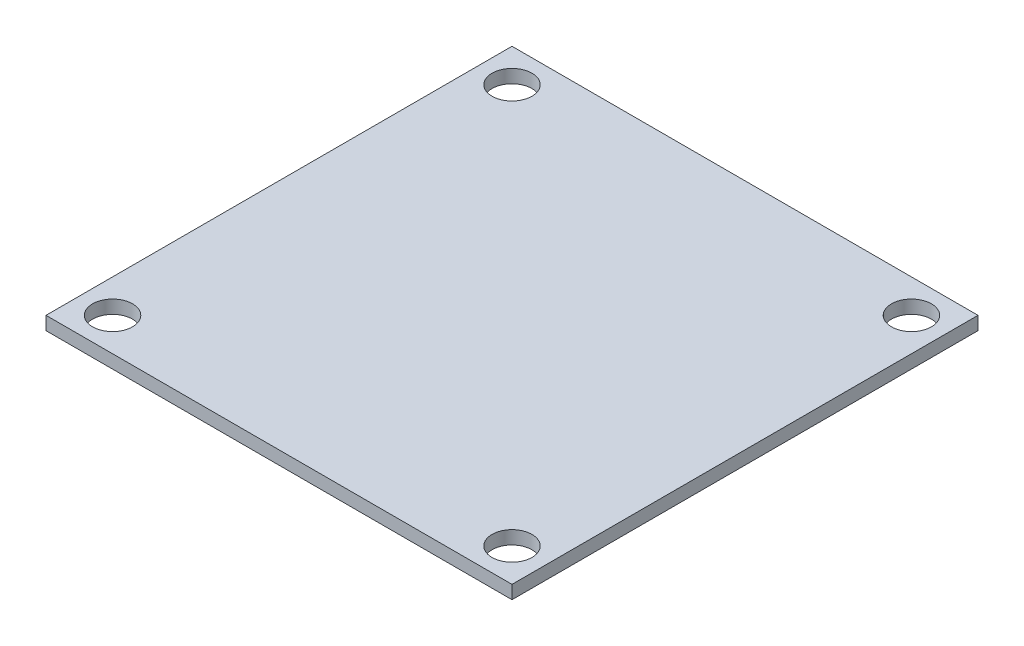
ISO-10303-21;
HEADER;
FILE_DESCRIPTION(('STEP AP214'),'2;1');
FILE_NAME('part.step','',(''),(''),'','','');
FILE_SCHEMA(('AUTOMOTIVE_DESIGN { 1 0 10303 214 1 1 1 1 }'));
ENDSEC;
DATA;
#1=APPLICATION_CONTEXT('core data for automotive mechanical design processes');
#2=APPLICATION_PROTOCOL_DEFINITION('international standard','automotive_design',2000,#1);
#3=PRODUCT_CONTEXT('',#1,'mechanical');
#4=PRODUCT('Part','Part','',(#3));
#5=PRODUCT_RELATED_PRODUCT_CATEGORY('part','',(#4));
#6=PRODUCT_DEFINITION_FORMATION('','',#4);
#7=PRODUCT_DEFINITION_CONTEXT('part definition',#1,'design');
#8=PRODUCT_DEFINITION('design','',#6,#7);
#9=PRODUCT_DEFINITION_SHAPE('','',#8);
#10=(LENGTH_UNIT() NAMED_UNIT(*) SI_UNIT(.MILLI.,.METRE.));
#11=(NAMED_UNIT(*) PLANE_ANGLE_UNIT() SI_UNIT($,.RADIAN.));
#12=(NAMED_UNIT(*) SI_UNIT($,.STERADIAN.) SOLID_ANGLE_UNIT());
#13=UNCERTAINTY_MEASURE_WITH_UNIT(LENGTH_MEASURE(1.E-05),#10,'distance_accuracy_value','');
#14=(GEOMETRIC_REPRESENTATION_CONTEXT(3) GLOBAL_UNCERTAINTY_ASSIGNED_CONTEXT((#13)) GLOBAL_UNIT_ASSIGNED_CONTEXT((#10,
#11,#12)) REPRESENTATION_CONTEXT('',''));
#15=CARTESIAN_POINT('',(0.,0.,0.));
#16=DIRECTION('',(0.,0.,1.));
#17=DIRECTION('',(1.,0.,0.));
#18=AXIS2_PLACEMENT_3D('',#15,#16,#17);
#19=CARTESIAN_POINT('',(35.,2.,-35.));
#20=DIRECTION('',(-1.,0.,0.));
#21=DIRECTION('',(0.,0.,1.));
#22=AXIS2_PLACEMENT_3D('',#19,#20,#21);
#23=PLANE('',#22);
#24=DIRECTION('',(0.,0.,-1.));
#25=VECTOR('',#24,1.);
#26=CARTESIAN_POINT('',(35.,0.,-35.));
#27=LINE('',#26,#25);
#28=CARTESIAN_POINT('',(35.,0.,35.));
#29=VERTEX_POINT('',#28);
#30=CARTESIAN_POINT('',(35.,0.,-35.));
#31=VERTEX_POINT('',#30);
#32=EDGE_CURVE('E96',#29,#31,#27,.T.);
#33=ORIENTED_EDGE('',*,*,#32,.T.);
#34=DIRECTION('',(0.,-1.,0.));
#35=VECTOR('',#34,1.);
#36=CARTESIAN_POINT('',(35.,2.,-35.));
#37=LINE('',#36,#35);
#38=CARTESIAN_POINT('',(35.,2.,-35.));
#39=VERTEX_POINT('',#38);
#40=EDGE_CURVE('E11',#39,#31,#37,.T.);
#41=ORIENTED_EDGE('',*,*,#40,.F.);
#42=DIRECTION('',(0.,0.,-1.));
#43=VECTOR('',#42,1.);
#44=CARTESIAN_POINT('',(35.,2.,-35.));
#45=LINE('',#44,#43);
#46=CARTESIAN_POINT('',(35.,2.,35.));
#47=VERTEX_POINT('',#46);
#48=EDGE_CURVE('E84',#47,#39,#45,.T.);
#49=ORIENTED_EDGE('',*,*,#48,.F.);
#50=DIRECTION('',(0.,-1.,0.));
#51=VECTOR('',#50,1.);
#52=CARTESIAN_POINT('',(35.,2.,35.));
#53=LINE('',#52,#51);
#54=EDGE_CURVE('E92',#47,#29,#53,.T.);
#55=ORIENTED_EDGE('',*,*,#54,.T.);
#56=EDGE_LOOP('',(#33,#41,#49,#55));
#57=FACE_BOUND('',#56,.T.);
#58=ADVANCED_FACE('F33',(#57),#23,.F.);
#59=CARTESIAN_POINT('',(-35.,2.,-35.));
#60=DIRECTION('',(0.,0.,1.));
#61=DIRECTION('',(1.,0.,0.));
#62=AXIS2_PLACEMENT_3D('',#59,#60,#61);
#63=PLANE('',#62);
#64=DIRECTION('',(-1.,0.,0.));
#65=VECTOR('',#64,1.);
#66=CARTESIAN_POINT('',(-35.,0.,-35.));
#67=LINE('',#66,#65);
#68=CARTESIAN_POINT('',(-35.,0.,-35.));
#69=VERTEX_POINT('',#68);
#70=EDGE_CURVE('E88',#31,#69,#67,.T.);
#71=ORIENTED_EDGE('',*,*,#70,.T.);
#72=DIRECTION('',(0.,-1.,0.));
#73=VECTOR('',#72,1.);
#74=CARTESIAN_POINT('',(-35.,2.,-35.));
#75=LINE('',#74,#73);
#76=CARTESIAN_POINT('',(-35.,2.,-35.));
#77=VERTEX_POINT('',#76);
#78=EDGE_CURVE('E41',#77,#69,#75,.T.);
#79=ORIENTED_EDGE('',*,*,#78,.F.);
#80=DIRECTION('',(-1.,0.,0.));
#81=VECTOR('',#80,1.);
#82=CARTESIAN_POINT('',(-35.,2.,-35.));
#83=LINE('',#82,#81);
#84=EDGE_CURVE('E79',#39,#77,#83,.T.);
#85=ORIENTED_EDGE('',*,*,#84,.F.);
#86=ORIENTED_EDGE('',*,*,#40,.T.);
#87=EDGE_LOOP('',(#71,#79,#85,#86));
#88=FACE_BOUND('',#87,.T.);
#89=ADVANCED_FACE('F87',(#88),#63,.F.);
#90=CARTESIAN_POINT('',(-35.,2.,-35.));
#91=DIRECTION('',(1.,0.,0.));
#92=DIRECTION('',(0.,0.,-1.));
#93=AXIS2_PLACEMENT_3D('',#90,#91,#92);
#94=PLANE('',#93);
#95=DIRECTION('',(0.,0.,1.));
#96=VECTOR('',#95,1.);
#97=CARTESIAN_POINT('',(-35.,0.,-35.));
#98=LINE('',#97,#96);
#99=CARTESIAN_POINT('',(-35.,0.,35.));
#100=VERTEX_POINT('',#99);
#101=EDGE_CURVE('E66',#69,#100,#98,.T.);
#102=ORIENTED_EDGE('',*,*,#101,.T.);
#103=DIRECTION('',(0.,-1.,0.));
#104=VECTOR('',#103,1.);
#105=CARTESIAN_POINT('',(-35.,2.,35.));
#106=LINE('',#105,#104);
#107=CARTESIAN_POINT('',(-35.,2.,35.));
#108=VERTEX_POINT('',#107);
#109=EDGE_CURVE('E89',#108,#100,#106,.T.);
#110=ORIENTED_EDGE('',*,*,#109,.F.);
#111=DIRECTION('',(0.,0.,1.));
#112=VECTOR('',#111,1.);
#113=CARTESIAN_POINT('',(-35.,2.,-35.));
#114=LINE('',#113,#112);
#115=EDGE_CURVE('E82',#77,#108,#114,.T.);
#116=ORIENTED_EDGE('',*,*,#115,.F.);
#117=ORIENTED_EDGE('',*,*,#78,.T.);
#118=EDGE_LOOP('',(#102,#110,#116,#117));
#119=FACE_BOUND('',#118,.T.);
#120=ADVANCED_FACE('F90',(#119),#94,.F.);
#121=CARTESIAN_POINT('',(-35.,2.,35.));
#122=DIRECTION('',(0.,0.,-1.));
#123=DIRECTION('',(-1.,0.,0.));
#124=AXIS2_PLACEMENT_3D('',#121,#122,#123);
#125=PLANE('',#124);
#126=DIRECTION('',(1.,0.,0.));
#127=VECTOR('',#126,1.);
#128=CARTESIAN_POINT('',(-35.,0.,35.));
#129=LINE('',#128,#127);
#130=EDGE_CURVE('E72',#100,#29,#129,.T.);
#131=ORIENTED_EDGE('',*,*,#130,.T.);
#132=ORIENTED_EDGE('',*,*,#54,.F.);
#133=DIRECTION('',(1.,0.,0.));
#134=VECTOR('',#133,1.);
#135=CARTESIAN_POINT('',(-35.,2.,35.));
#136=LINE('',#135,#134);
#137=EDGE_CURVE('E49',#108,#47,#136,.T.);
#138=ORIENTED_EDGE('',*,*,#137,.F.);
#139=ORIENTED_EDGE('',*,*,#109,.T.);
#140=EDGE_LOOP('',(#131,#132,#138,#139));
#141=FACE_BOUND('',#140,.T.);
#142=ADVANCED_FACE('F104',(#141),#125,.F.);
#143=CARTESIAN_POINT('',(0.,2.,0.));
#144=DIRECTION('',(0.,1.,0.));
#145=DIRECTION('',(0.,0.,1.));
#146=AXIS2_PLACEMENT_3D('',#143,#144,#145);
#147=PLANE('',#146);
#148=CARTESIAN_POINT('',(30.,2.,-30.));
#149=DIRECTION('',(0.,1.,0.));
#150=DIRECTION('',(0.,0.,1.));
#151=AXIS2_PLACEMENT_3D('',#148,#149,#150);
#152=CIRCLE('',#151,3.);
#153=CARTESIAN_POINT('',(30.,2.,-27.));
#154=VERTEX_POINT('',#153);
#155=EDGE_CURVE('E123',#154,#154,#152,.T.);
#156=ORIENTED_EDGE('',*,*,#155,.F.);
#157=EDGE_LOOP('',(#156));
#158=FACE_BOUND('',#157,.T.);
#159=CARTESIAN_POINT('',(-29.9999999999994,2.,30.));
#160=DIRECTION('',(0.,1.,0.));
#161=DIRECTION('',(0.,0.,1.));
#162=AXIS2_PLACEMENT_3D('',#159,#160,#161);
#163=CIRCLE('',#162,3.);
#164=CARTESIAN_POINT('',(-29.9999999999994,2.,33.));
#165=VERTEX_POINT('',#164);
#166=EDGE_CURVE('E116',#165,#165,#163,.T.);
#167=ORIENTED_EDGE('',*,*,#166,.F.);
#168=EDGE_LOOP('',(#167));
#169=FACE_BOUND('',#168,.T.);
#170=CARTESIAN_POINT('',(30.0000000000006,2.,30.));
#171=DIRECTION('',(0.,1.,0.));
#172=DIRECTION('',(0.,0.,1.));
#173=AXIS2_PLACEMENT_3D('',#170,#171,#172);
#174=CIRCLE('',#173,3.);
#175=CARTESIAN_POINT('',(30.0000000000006,2.,33.));
#176=VERTEX_POINT('',#175);
#177=EDGE_CURVE('E128',#176,#176,#174,.T.);
#178=ORIENTED_EDGE('',*,*,#177,.F.);
#179=EDGE_LOOP('',(#178));
#180=FACE_BOUND('',#179,.T.);
#181=CARTESIAN_POINT('',(-30.,2.,-30.));
#182=DIRECTION('',(0.,1.,0.));
#183=DIRECTION('',(0.,0.,1.));
#184=AXIS2_PLACEMENT_3D('',#181,#182,#183);
#185=CIRCLE('',#184,3.);
#186=CARTESIAN_POINT('',(-30.,2.,-27.));
#187=VERTEX_POINT('',#186);
#188=EDGE_CURVE('E110',#187,#187,#185,.T.);
#189=ORIENTED_EDGE('',*,*,#188,.F.);
#190=EDGE_LOOP('',(#189));
#191=FACE_BOUND('',#190,.T.);
#192=ORIENTED_EDGE('',*,*,#48,.T.);
#193=ORIENTED_EDGE('',*,*,#84,.T.);
#194=ORIENTED_EDGE('',*,*,#115,.T.);
#195=ORIENTED_EDGE('',*,*,#137,.T.);
#196=EDGE_LOOP('',(#192,#193,#194,#195));
#197=FACE_BOUND('',#196,.T.);
#198=ADVANCED_FACE('F80',(#158,#169,#180,#191,#197),#147,.T.);
#199=CARTESIAN_POINT('',(0.,0.,0.));
#200=DIRECTION('',(0.,1.,0.));
#201=DIRECTION('',(0.,0.,1.));
#202=AXIS2_PLACEMENT_3D('',#199,#200,#201);
#203=PLANE('',#202);
#204=CARTESIAN_POINT('',(30.,0.,-30.));
#205=DIRECTION('',(0.,1.,0.));
#206=DIRECTION('',(0.,0.,1.));
#207=AXIS2_PLACEMENT_3D('',#204,#205,#206);
#208=CIRCLE('',#207,3.);
#209=CARTESIAN_POINT('',(30.,0.,-27.));
#210=VERTEX_POINT('',#209);
#211=EDGE_CURVE('E113',#210,#210,#208,.T.);
#212=ORIENTED_EDGE('',*,*,#211,.T.);
#213=EDGE_LOOP('',(#212));
#214=FACE_BOUND('',#213,.T.);
#215=CARTESIAN_POINT('',(-29.9999999999994,0.,30.));
#216=DIRECTION('',(0.,1.,0.));
#217=DIRECTION('',(0.,0.,1.));
#218=AXIS2_PLACEMENT_3D('',#215,#216,#217);
#219=CIRCLE('',#218,3.);
#220=CARTESIAN_POINT('',(-29.9999999999994,0.,33.));
#221=VERTEX_POINT('',#220);
#222=EDGE_CURVE('E119',#221,#221,#219,.T.);
#223=ORIENTED_EDGE('',*,*,#222,.T.);
#224=EDGE_LOOP('',(#223));
#225=FACE_BOUND('',#224,.T.);
#226=CARTESIAN_POINT('',(30.0000000000006,0.,30.));
#227=DIRECTION('',(0.,1.,0.));
#228=DIRECTION('',(0.,0.,1.));
#229=AXIS2_PLACEMENT_3D('',#226,#227,#228);
#230=CIRCLE('',#229,3.);
#231=CARTESIAN_POINT('',(30.0000000000006,0.,33.));
#232=VERTEX_POINT('',#231);
#233=EDGE_CURVE('E120',#232,#232,#230,.T.);
#234=ORIENTED_EDGE('',*,*,#233,.T.);
#235=EDGE_LOOP('',(#234));
#236=FACE_BOUND('',#235,.T.);
#237=CARTESIAN_POINT('',(-30.,0.,-30.));
#238=DIRECTION('',(0.,1.,0.));
#239=DIRECTION('',(0.,0.,1.));
#240=AXIS2_PLACEMENT_3D('',#237,#238,#239);
#241=CIRCLE('',#240,3.);
#242=CARTESIAN_POINT('',(-30.,0.,-27.));
#243=VERTEX_POINT('',#242);
#244=EDGE_CURVE('E99',#243,#243,#241,.T.);
#245=ORIENTED_EDGE('',*,*,#244,.T.);
#246=EDGE_LOOP('',(#245));
#247=FACE_BOUND('',#246,.T.);
#248=ORIENTED_EDGE('',*,*,#32,.F.);
#249=ORIENTED_EDGE('',*,*,#130,.F.);
#250=ORIENTED_EDGE('',*,*,#101,.F.);
#251=ORIENTED_EDGE('',*,*,#70,.F.);
#252=EDGE_LOOP('',(#248,#249,#250,#251));
#253=FACE_BOUND('',#252,.T.);
#254=ADVANCED_FACE('F107',(#214,#225,#236,#247,#253),#203,.F.);
#255=CARTESIAN_POINT('',(-30.,0.,-30.));
#256=DIRECTION('',(0.,1.,0.));
#257=DIRECTION('',(0.,0.,1.));
#258=AXIS2_PLACEMENT_3D('',#255,#256,#257);
#259=CYLINDRICAL_SURFACE('',#258,3.);
#260=ORIENTED_EDGE('',*,*,#244,.F.);
#261=EDGE_LOOP('',(#260));
#262=FACE_BOUND('',#261,.T.);
#263=ORIENTED_EDGE('',*,*,#188,.T.);
#264=EDGE_LOOP('',(#263));
#265=FACE_BOUND('',#264,.T.);
#266=ADVANCED_FACE('F140',(#262,#265),#259,.F.);
#267=CARTESIAN_POINT('',(30.0000000000006,0.,30.));
#268=DIRECTION('',(0.,1.,0.));
#269=DIRECTION('',(0.,0.,1.));
#270=AXIS2_PLACEMENT_3D('',#267,#268,#269);
#271=CYLINDRICAL_SURFACE('',#270,3.);
#272=ORIENTED_EDGE('',*,*,#233,.F.);
#273=EDGE_LOOP('',(#272));
#274=FACE_BOUND('',#273,.T.);
#275=ORIENTED_EDGE('',*,*,#177,.T.);
#276=EDGE_LOOP('',(#275));
#277=FACE_BOUND('',#276,.T.);
#278=ADVANCED_FACE('F136',(#274,#277),#271,.F.);
#279=CARTESIAN_POINT('',(-29.9999999999994,0.,30.));
#280=DIRECTION('',(0.,1.,0.));
#281=DIRECTION('',(0.,0.,1.));
#282=AXIS2_PLACEMENT_3D('',#279,#280,#281);
#283=CYLINDRICAL_SURFACE('',#282,3.);
#284=ORIENTED_EDGE('',*,*,#222,.F.);
#285=EDGE_LOOP('',(#284));
#286=FACE_BOUND('',#285,.T.);
#287=ORIENTED_EDGE('',*,*,#166,.T.);
#288=EDGE_LOOP('',(#287));
#289=FACE_BOUND('',#288,.T.);
#290=ADVANCED_FACE('F139',(#286,#289),#283,.F.);
#291=CARTESIAN_POINT('',(30.,0.,-30.));
#292=DIRECTION('',(0.,1.,0.));
#293=DIRECTION('',(0.,0.,1.));
#294=AXIS2_PLACEMENT_3D('',#291,#292,#293);
#295=CYLINDRICAL_SURFACE('',#294,3.);
#296=ORIENTED_EDGE('',*,*,#211,.F.);
#297=EDGE_LOOP('',(#296));
#298=FACE_BOUND('',#297,.T.);
#299=ORIENTED_EDGE('',*,*,#155,.T.);
#300=EDGE_LOOP('',(#299));
#301=FACE_BOUND('',#300,.T.);
#302=ADVANCED_FACE('F201',(#298,#301),#295,.F.);
#303=CLOSED_SHELL('',(#58,#89,#120,#142,#198,#254,#266,#278,#290,#302));
#304=MANIFOLD_SOLID_BREP('B2',#303);
#305=ADVANCED_BREP_SHAPE_REPRESENTATION('',(#18,#304),#14);
#306=SHAPE_DEFINITION_REPRESENTATION(#9,#305);
ENDSEC;
END-ISO-10303-21;
